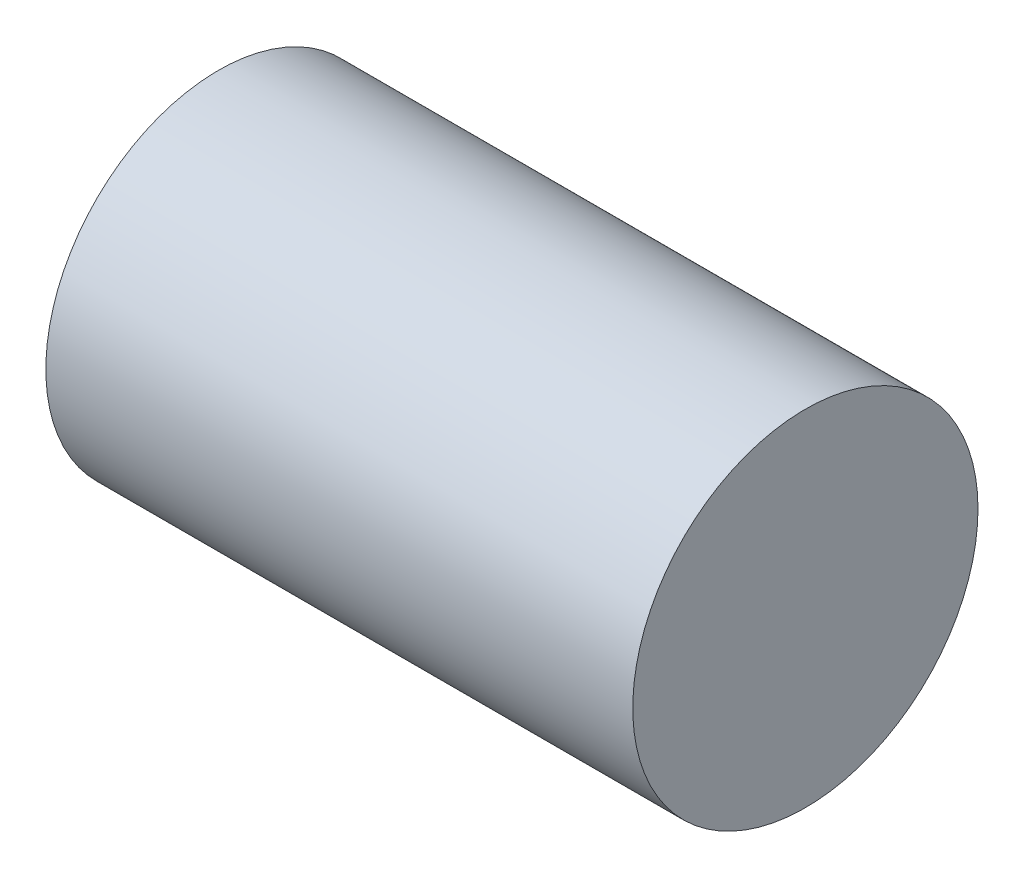
ISO-10303-21;
HEADER;
FILE_DESCRIPTION(('STEP AP214'),'2;1');
FILE_NAME('part.step','',(''),(''),'','','');
FILE_SCHEMA(('AUTOMOTIVE_DESIGN { 1 0 10303 214 1 1 1 1 }'));
ENDSEC;
DATA;
#1=APPLICATION_CONTEXT('core data for automotive mechanical design processes');
#2=APPLICATION_PROTOCOL_DEFINITION('international standard','automotive_design',2000,#1);
#3=PRODUCT_CONTEXT('',#1,'mechanical');
#4=PRODUCT('Part','Part','',(#3));
#5=PRODUCT_RELATED_PRODUCT_CATEGORY('part','',(#4));
#6=PRODUCT_DEFINITION_FORMATION('','',#4);
#7=PRODUCT_DEFINITION_CONTEXT('part definition',#1,'design');
#8=PRODUCT_DEFINITION('design','',#6,#7);
#9=PRODUCT_DEFINITION_SHAPE('','',#8);
#10=(LENGTH_UNIT() NAMED_UNIT(*) SI_UNIT(.MILLI.,.METRE.));
#11=(NAMED_UNIT(*) PLANE_ANGLE_UNIT() SI_UNIT($,.RADIAN.));
#12=(NAMED_UNIT(*) SI_UNIT($,.STERADIAN.) SOLID_ANGLE_UNIT());
#13=UNCERTAINTY_MEASURE_WITH_UNIT(LENGTH_MEASURE(1.E-05),#10,'distance_accuracy_value','');
#14=(GEOMETRIC_REPRESENTATION_CONTEXT(3) GLOBAL_UNCERTAINTY_ASSIGNED_CONTEXT((#13)) GLOBAL_UNIT_ASSIGNED_CONTEXT((#10,
#11,#12)) REPRESENTATION_CONTEXT('',''));
#15=CARTESIAN_POINT('',(0.,0.,0.));
#16=DIRECTION('',(0.,0.,1.));
#17=DIRECTION('',(1.,0.,0.));
#18=AXIS2_PLACEMENT_3D('',#15,#16,#17);
#19=CARTESIAN_POINT('',(8.5,0.,0.));
#20=DIRECTION('',(-1.,0.,0.));
#21=DIRECTION('',(0.,0.,1.));
#22=AXIS2_PLACEMENT_3D('',#19,#20,#21);
#23=CYLINDRICAL_SURFACE('',#22,2.5);
#24=CARTESIAN_POINT('',(8.5,0.,0.));
#25=DIRECTION('',(1.,0.,0.));
#26=DIRECTION('',(0.,0.,-1.));
#27=AXIS2_PLACEMENT_3D('',#24,#25,#26);
#28=CIRCLE('',#27,2.5);
#29=CARTESIAN_POINT('',(8.5,0.,-2.5));
#30=VERTEX_POINT('',#29);
#31=EDGE_CURVE('E10',#30,#30,#28,.T.);
#32=ORIENTED_EDGE('',*,*,#31,.F.);
#33=EDGE_LOOP('',(#32));
#34=FACE_BOUND('',#33,.T.);
#35=CARTESIAN_POINT('',(0.,0.,0.));
#36=DIRECTION('',(1.,0.,0.));
#37=DIRECTION('',(0.,0.,-1.));
#38=AXIS2_PLACEMENT_3D('',#35,#36,#37);
#39=CIRCLE('',#38,2.5);
#40=CARTESIAN_POINT('',(0.,0.,-2.5));
#41=VERTEX_POINT('',#40);
#42=EDGE_CURVE('E36',#41,#41,#39,.T.);
#43=ORIENTED_EDGE('',*,*,#42,.T.);
#44=EDGE_LOOP('',(#43));
#45=FACE_BOUND('',#44,.T.);
#46=ADVANCED_FACE('F33',(#34,#45),#23,.T.);
#47=CARTESIAN_POINT('',(8.5,0.,0.));
#48=DIRECTION('',(1.,0.,0.));
#49=DIRECTION('',(0.,0.,-1.));
#50=AXIS2_PLACEMENT_3D('',#47,#48,#49);
#51=PLANE('',#50);
#52=ORIENTED_EDGE('',*,*,#31,.T.);
#53=EDGE_LOOP('',(#52));
#54=FACE_BOUND('',#53,.T.);
#55=ADVANCED_FACE('F48',(#54),#51,.T.);
#56=CARTESIAN_POINT('',(0.,0.,0.));
#57=DIRECTION('',(1.,0.,0.));
#58=DIRECTION('',(0.,0.,-1.));
#59=AXIS2_PLACEMENT_3D('',#56,#57,#58);
#60=PLANE('',#59);
#61=ORIENTED_EDGE('',*,*,#42,.F.);
#62=EDGE_LOOP('',(#61));
#63=FACE_BOUND('',#62,.T.);
#64=ADVANCED_FACE('F46',(#63),#60,.F.);
#65=CLOSED_SHELL('',(#46,#55,#64));
#66=MANIFOLD_SOLID_BREP('B2',#65);
#67=ADVANCED_BREP_SHAPE_REPRESENTATION('',(#18,#66),#14);
#68=SHAPE_DEFINITION_REPRESENTATION(#9,#67);
ENDSEC;
END-ISO-10303-21;
